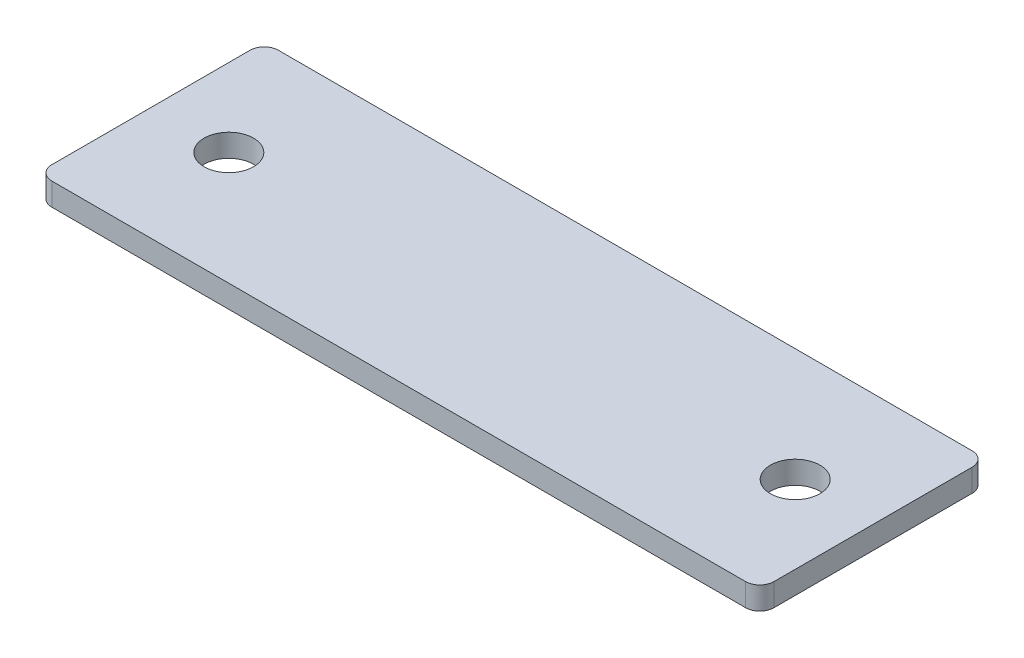
ISO-10303-21;
HEADER;
FILE_DESCRIPTION(('STEP AP214'),'2;1');
FILE_NAME('part.step','',(''),(''),'','','');
FILE_SCHEMA(('AUTOMOTIVE_DESIGN { 1 0 10303 214 1 1 1 1 }'));
ENDSEC;
DATA;
#1=APPLICATION_CONTEXT('core data for automotive mechanical design processes');
#2=APPLICATION_PROTOCOL_DEFINITION('international standard','automotive_design',2000,#1);
#3=PRODUCT_CONTEXT('',#1,'mechanical');
#4=PRODUCT('Part','Part','',(#3));
#5=PRODUCT_RELATED_PRODUCT_CATEGORY('part','',(#4));
#6=PRODUCT_DEFINITION_FORMATION('','',#4);
#7=PRODUCT_DEFINITION_CONTEXT('part definition',#1,'design');
#8=PRODUCT_DEFINITION('design','',#6,#7);
#9=PRODUCT_DEFINITION_SHAPE('','',#8);
#10=(LENGTH_UNIT() NAMED_UNIT(*) SI_UNIT(.MILLI.,.METRE.));
#11=(NAMED_UNIT(*) PLANE_ANGLE_UNIT() SI_UNIT($,.RADIAN.));
#12=(NAMED_UNIT(*) SI_UNIT($,.STERADIAN.) SOLID_ANGLE_UNIT());
#13=UNCERTAINTY_MEASURE_WITH_UNIT(LENGTH_MEASURE(1.E-05),#10,'distance_accuracy_value','');
#14=(GEOMETRIC_REPRESENTATION_CONTEXT(3) GLOBAL_UNCERTAINTY_ASSIGNED_CONTEXT((#13)) GLOBAL_UNIT_ASSIGNED_CONTEXT((#10,
#11,#12)) REPRESENTATION_CONTEXT('',''));
#15=CARTESIAN_POINT('',(0.,0.,0.));
#16=DIRECTION('',(0.,0.,1.));
#17=DIRECTION('',(1.,0.,0.));
#18=AXIS2_PLACEMENT_3D('',#15,#16,#17);
#19=CARTESIAN_POINT('',(0.,1.6,0.));
#20=DIRECTION('',(0.,1.,0.));
#21=DIRECTION('',(0.,0.,1.));
#22=AXIS2_PLACEMENT_3D('',#19,#20,#21);
#23=PLANE('',#22);
#24=CARTESIAN_POINT('',(-20.,1.6,0.));
#25=DIRECTION('',(0.,1.,0.));
#26=DIRECTION('',(0.,0.,1.));
#27=AXIS2_PLACEMENT_3D('',#24,#25,#26);
#28=CIRCLE('',#27,1.75);
#29=CARTESIAN_POINT('',(-20.,1.6,1.75));
#30=VERTEX_POINT('',#29);
#31=EDGE_CURVE('E163',#30,#30,#28,.T.);
#32=ORIENTED_EDGE('',*,*,#31,.F.);
#33=EDGE_LOOP('',(#32));
#34=FACE_BOUND('',#33,.T.);
#35=DIRECTION('',(-1.,0.,0.));
#36=VECTOR('',#35,1.);
#37=CARTESIAN_POINT('',(-25.5,1.6,-8.));
#38=LINE('',#37,#36);
#39=CARTESIAN_POINT('',(24.5,1.6,-8.));
#40=VERTEX_POINT('',#39);
#41=CARTESIAN_POINT('',(-24.5,1.6,-8.));
#42=VERTEX_POINT('',#41);
#43=EDGE_CURVE('E170',#40,#42,#38,.T.);
#44=ORIENTED_EDGE('',*,*,#43,.T.);
#45=CARTESIAN_POINT('',(-24.5,1.6,-7.));
#46=DIRECTION('',(0.,1.,0.));
#47=DIRECTION('',(0.,0.,1.));
#48=AXIS2_PLACEMENT_3D('',#45,#46,#47);
#49=CIRCLE('',#48,1.);
#50=CARTESIAN_POINT('',(-25.5,1.6,-7.));
#51=VERTEX_POINT('',#50);
#52=EDGE_CURVE('E147',#42,#51,#49,.T.);
#53=ORIENTED_EDGE('',*,*,#52,.T.);
#54=DIRECTION('',(0.,0.,1.));
#55=VECTOR('',#54,1.);
#56=CARTESIAN_POINT('',(-25.5,1.6,-8.));
#57=LINE('',#56,#55);
#58=CARTESIAN_POINT('',(-25.5,1.6,7.));
#59=VERTEX_POINT('',#58);
#60=EDGE_CURVE('E117',#51,#59,#57,.T.);
#61=ORIENTED_EDGE('',*,*,#60,.T.);
#62=CARTESIAN_POINT('',(-24.5,1.6,7.));
#63=DIRECTION('',(0.,1.,0.));
#64=DIRECTION('',(0.,0.,1.));
#65=AXIS2_PLACEMENT_3D('',#62,#63,#64);
#66=CIRCLE('',#65,1.);
#67=CARTESIAN_POINT('',(-24.5,1.6,8.));
#68=VERTEX_POINT('',#67);
#69=EDGE_CURVE('E54',#59,#68,#66,.T.);
#70=ORIENTED_EDGE('',*,*,#69,.T.);
#71=DIRECTION('',(1.,0.,0.));
#72=VECTOR('',#71,1.);
#73=CARTESIAN_POINT('',(-25.5,1.6,8.));
#74=LINE('',#73,#72);
#75=CARTESIAN_POINT('',(24.5,1.6,8.));
#76=VERTEX_POINT('',#75);
#77=EDGE_CURVE('E133',#68,#76,#74,.T.);
#78=ORIENTED_EDGE('',*,*,#77,.T.);
#79=CARTESIAN_POINT('',(24.5,1.6,7.));
#80=DIRECTION('',(0.,1.,0.));
#81=DIRECTION('',(0.,0.,1.));
#82=AXIS2_PLACEMENT_3D('',#79,#80,#81);
#83=CIRCLE('',#82,1.);
#84=CARTESIAN_POINT('',(25.5,1.6,7.));
#85=VERTEX_POINT('',#84);
#86=EDGE_CURVE('E142',#76,#85,#83,.T.);
#87=ORIENTED_EDGE('',*,*,#86,.T.);
#88=DIRECTION('',(0.,0.,-1.));
#89=VECTOR('',#88,1.);
#90=CARTESIAN_POINT('',(25.5,1.6,-8.));
#91=LINE('',#90,#89);
#92=CARTESIAN_POINT('',(25.5,1.6,-7.));
#93=VERTEX_POINT('',#92);
#94=EDGE_CURVE('E127',#85,#93,#91,.T.);
#95=ORIENTED_EDGE('',*,*,#94,.T.);
#96=CARTESIAN_POINT('',(24.5,1.6,-7.));
#97=DIRECTION('',(0.,1.,0.));
#98=DIRECTION('',(0.,0.,1.));
#99=AXIS2_PLACEMENT_3D('',#96,#97,#98);
#100=CIRCLE('',#99,1.);
#101=EDGE_CURVE('E144',#93,#40,#100,.T.);
#102=ORIENTED_EDGE('',*,*,#101,.T.);
#103=EDGE_LOOP('',(#44,#53,#61,#70,#78,#87,#95,#102));
#104=FACE_BOUND('',#103,.T.);
#105=CARTESIAN_POINT('',(20.,1.6,0.));
#106=DIRECTION('',(0.,1.,0.));
#107=DIRECTION('',(0.,0.,1.));
#108=AXIS2_PLACEMENT_3D('',#105,#106,#107);
#109=CIRCLE('',#108,1.75);
#110=CARTESIAN_POINT('',(20.,1.6,1.74999999999999));
#111=VERTEX_POINT('',#110);
#112=EDGE_CURVE('E175',#111,#111,#109,.T.);
#113=ORIENTED_EDGE('',*,*,#112,.F.);
#114=EDGE_LOOP('',(#113));
#115=FACE_BOUND('',#114,.T.);
#116=ADVANCED_FACE('F32',(#34,#104,#115),#23,.T.);
#117=CARTESIAN_POINT('',(0.,0.,0.));
#118=DIRECTION('',(0.,1.,0.));
#119=DIRECTION('',(0.,0.,1.));
#120=AXIS2_PLACEMENT_3D('',#117,#118,#119);
#121=PLANE('',#120);
#122=CARTESIAN_POINT('',(-20.,0.,0.));
#123=DIRECTION('',(0.,1.,0.));
#124=DIRECTION('',(0.,0.,1.));
#125=AXIS2_PLACEMENT_3D('',#122,#123,#124);
#126=CIRCLE('',#125,1.75);
#127=CARTESIAN_POINT('',(-20.,0.,1.75));
#128=VERTEX_POINT('',#127);
#129=EDGE_CURVE('E165',#128,#128,#126,.T.);
#130=ORIENTED_EDGE('',*,*,#129,.T.);
#131=EDGE_LOOP('',(#130));
#132=FACE_BOUND('',#131,.T.);
#133=DIRECTION('',(0.,0.,1.));
#134=VECTOR('',#133,1.);
#135=CARTESIAN_POINT('',(-25.5,0.,-8.));
#136=LINE('',#135,#134);
#137=CARTESIAN_POINT('',(-25.5,0.,-7.));
#138=VERTEX_POINT('',#137);
#139=CARTESIAN_POINT('',(-25.5,0.,7.));
#140=VERTEX_POINT('',#139);
#141=EDGE_CURVE('E115',#138,#140,#136,.T.);
#142=ORIENTED_EDGE('',*,*,#141,.F.);
#143=CARTESIAN_POINT('',(-24.5,0.,-7.));
#144=DIRECTION('',(0.,1.,0.));
#145=DIRECTION('',(0.,0.,1.));
#146=AXIS2_PLACEMENT_3D('',#143,#144,#145);
#147=CIRCLE('',#146,1.);
#148=CARTESIAN_POINT('',(-24.5,0.,-8.));
#149=VERTEX_POINT('',#148);
#150=EDGE_CURVE('E98',#138,#149,#147,.F.);
#151=ORIENTED_EDGE('',*,*,#150,.T.);
#152=DIRECTION('',(-1.,0.,0.));
#153=VECTOR('',#152,1.);
#154=CARTESIAN_POINT('',(-25.5,0.,-8.));
#155=LINE('',#154,#153);
#156=CARTESIAN_POINT('',(24.5,0.,-8.));
#157=VERTEX_POINT('',#156);
#158=EDGE_CURVE('E125',#157,#149,#155,.T.);
#159=ORIENTED_EDGE('',*,*,#158,.F.);
#160=CARTESIAN_POINT('',(24.5,0.,-7.));
#161=DIRECTION('',(0.,1.,0.));
#162=DIRECTION('',(0.,0.,1.));
#163=AXIS2_PLACEMENT_3D('',#160,#161,#162);
#164=CIRCLE('',#163,1.);
#165=CARTESIAN_POINT('',(25.5,0.,-7.));
#166=VERTEX_POINT('',#165);
#167=EDGE_CURVE('E136',#157,#166,#164,.F.);
#168=ORIENTED_EDGE('',*,*,#167,.T.);
#169=DIRECTION('',(0.,0.,-1.));
#170=VECTOR('',#169,1.);
#171=CARTESIAN_POINT('',(25.5,0.,-8.));
#172=LINE('',#171,#170);
#173=CARTESIAN_POINT('',(25.5,0.,7.));
#174=VERTEX_POINT('',#173);
#175=EDGE_CURVE('E129',#174,#166,#172,.T.);
#176=ORIENTED_EDGE('',*,*,#175,.F.);
#177=CARTESIAN_POINT('',(24.5,0.,7.));
#178=DIRECTION('',(0.,1.,0.));
#179=DIRECTION('',(0.,0.,1.));
#180=AXIS2_PLACEMENT_3D('',#177,#178,#179);
#181=CIRCLE('',#180,1.);
#182=CARTESIAN_POINT('',(24.5,0.,8.));
#183=VERTEX_POINT('',#182);
#184=EDGE_CURVE('E118',#174,#183,#181,.F.);
#185=ORIENTED_EDGE('',*,*,#184,.T.);
#186=DIRECTION('',(1.,0.,0.));
#187=VECTOR('',#186,1.);
#188=CARTESIAN_POINT('',(-25.5,0.,8.));
#189=LINE('',#188,#187);
#190=CARTESIAN_POINT('',(-24.5,0.,8.));
#191=VERTEX_POINT('',#190);
#192=EDGE_CURVE('E124',#191,#183,#189,.T.);
#193=ORIENTED_EDGE('',*,*,#192,.F.);
#194=CARTESIAN_POINT('',(-24.5,0.,7.));
#195=DIRECTION('',(0.,1.,0.));
#196=DIRECTION('',(0.,0.,1.));
#197=AXIS2_PLACEMENT_3D('',#194,#195,#196);
#198=CIRCLE('',#197,1.);
#199=EDGE_CURVE('E109',#191,#140,#198,.F.);
#200=ORIENTED_EDGE('',*,*,#199,.T.);
#201=EDGE_LOOP('',(#142,#151,#159,#168,#176,#185,#193,#200));
#202=FACE_BOUND('',#201,.T.);
#203=CARTESIAN_POINT('',(20.,0.,0.));
#204=DIRECTION('',(0.,1.,0.));
#205=DIRECTION('',(0.,0.,1.));
#206=AXIS2_PLACEMENT_3D('',#203,#204,#205);
#207=CIRCLE('',#206,1.75);
#208=CARTESIAN_POINT('',(20.,0.,1.74999999999999));
#209=VERTEX_POINT('',#208);
#210=EDGE_CURVE('E177',#209,#209,#207,.T.);
#211=ORIENTED_EDGE('',*,*,#210,.T.);
#212=EDGE_LOOP('',(#211));
#213=FACE_BOUND('',#212,.T.);
#214=ADVANCED_FACE('F121',(#132,#202,#213),#121,.F.);
#215=CARTESIAN_POINT('',(25.5,1.6,-8.));
#216=DIRECTION('',(-1.,0.,0.));
#217=DIRECTION('',(0.,0.,1.));
#218=AXIS2_PLACEMENT_3D('',#215,#216,#217);
#219=PLANE('',#218);
#220=ORIENTED_EDGE('',*,*,#175,.T.);
#221=DIRECTION('',(0.,-1.,0.));
#222=VECTOR('',#221,1.);
#223=CARTESIAN_POINT('',(25.5,1.6,-7.));
#224=LINE('',#223,#222);
#225=EDGE_CURVE('E11',#166,#93,#224,.F.);
#226=ORIENTED_EDGE('',*,*,#225,.T.);
#227=ORIENTED_EDGE('',*,*,#94,.F.);
#228=DIRECTION('',(0.,-1.,0.));
#229=VECTOR('',#228,1.);
#230=CARTESIAN_POINT('',(25.5,1.6,7.));
#231=LINE('',#230,#229);
#232=EDGE_CURVE('E40',#85,#174,#231,.T.);
#233=ORIENTED_EDGE('',*,*,#232,.T.);
#234=EDGE_LOOP('',(#220,#226,#227,#233));
#235=FACE_BOUND('',#234,.T.);
#236=ADVANCED_FACE('F158',(#235),#219,.F.);
#237=CARTESIAN_POINT('',(-25.5,1.6,-8.));
#238=DIRECTION('',(0.,0.,1.));
#239=DIRECTION('',(1.,0.,0.));
#240=AXIS2_PLACEMENT_3D('',#237,#238,#239);
#241=PLANE('',#240);
#242=ORIENTED_EDGE('',*,*,#158,.T.);
#243=DIRECTION('',(0.,-1.,0.));
#244=VECTOR('',#243,1.);
#245=CARTESIAN_POINT('',(-24.5,1.6,-8.));
#246=LINE('',#245,#244);
#247=EDGE_CURVE('E103',#149,#42,#246,.F.);
#248=ORIENTED_EDGE('',*,*,#247,.T.);
#249=ORIENTED_EDGE('',*,*,#43,.F.);
#250=DIRECTION('',(0.,-1.,0.));
#251=VECTOR('',#250,1.);
#252=CARTESIAN_POINT('',(24.5,1.6,-8.));
#253=LINE('',#252,#251);
#254=EDGE_CURVE('E108',#40,#157,#253,.T.);
#255=ORIENTED_EDGE('',*,*,#254,.T.);
#256=EDGE_LOOP('',(#242,#248,#249,#255));
#257=FACE_BOUND('',#256,.T.);
#258=ADVANCED_FACE('F204',(#257),#241,.F.);
#259=CARTESIAN_POINT('',(-25.5,1.6,-8.));
#260=DIRECTION('',(1.,0.,0.));
#261=DIRECTION('',(0.,0.,-1.));
#262=AXIS2_PLACEMENT_3D('',#259,#260,#261);
#263=PLANE('',#262);
#264=ORIENTED_EDGE('',*,*,#60,.F.);
#265=DIRECTION('',(0.,-1.,0.));
#266=VECTOR('',#265,1.);
#267=CARTESIAN_POINT('',(-25.5,1.6,-7.));
#268=LINE('',#267,#266);
#269=EDGE_CURVE('E102',#51,#138,#268,.T.);
#270=ORIENTED_EDGE('',*,*,#269,.T.);
#271=ORIENTED_EDGE('',*,*,#141,.T.);
#272=DIRECTION('',(0.,-1.,0.));
#273=VECTOR('',#272,1.);
#274=CARTESIAN_POINT('',(-25.5,1.6,7.));
#275=LINE('',#274,#273);
#276=EDGE_CURVE('E119',#140,#59,#275,.F.);
#277=ORIENTED_EDGE('',*,*,#276,.T.);
#278=EDGE_LOOP('',(#264,#270,#271,#277));
#279=FACE_BOUND('',#278,.T.);
#280=ADVANCED_FACE('F114',(#279),#263,.F.);
#281=CARTESIAN_POINT('',(-25.5,1.6,8.));
#282=DIRECTION('',(0.,0.,-1.));
#283=DIRECTION('',(-1.,0.,0.));
#284=AXIS2_PLACEMENT_3D('',#281,#282,#283);
#285=PLANE('',#284);
#286=ORIENTED_EDGE('',*,*,#77,.F.);
#287=DIRECTION('',(0.,-1.,0.));
#288=VECTOR('',#287,1.);
#289=CARTESIAN_POINT('',(-24.5,1.6,8.));
#290=LINE('',#289,#288);
#291=EDGE_CURVE('E150',#68,#191,#290,.T.);
#292=ORIENTED_EDGE('',*,*,#291,.T.);
#293=ORIENTED_EDGE('',*,*,#192,.T.);
#294=DIRECTION('',(0.,-1.,0.));
#295=VECTOR('',#294,1.);
#296=CARTESIAN_POINT('',(24.5,1.6,8.));
#297=LINE('',#296,#295);
#298=EDGE_CURVE('E47',#183,#76,#297,.F.);
#299=ORIENTED_EDGE('',*,*,#298,.T.);
#300=EDGE_LOOP('',(#286,#292,#293,#299));
#301=FACE_BOUND('',#300,.T.);
#302=ADVANCED_FACE('F199',(#301),#285,.F.);
#303=CARTESIAN_POINT('',(-20.,1.6,0.));
#304=DIRECTION('',(0.,-1.,0.));
#305=DIRECTION('',(0.,0.,-1.));
#306=AXIS2_PLACEMENT_3D('',#303,#304,#305);
#307=CYLINDRICAL_SURFACE('',#306,1.75);
#308=ORIENTED_EDGE('',*,*,#31,.T.);
#309=EDGE_LOOP('',(#308));
#310=FACE_BOUND('',#309,.T.);
#311=ORIENTED_EDGE('',*,*,#129,.F.);
#312=EDGE_LOOP('',(#311));
#313=FACE_BOUND('',#312,.T.);
#314=ADVANCED_FACE('F196',(#310,#313),#307,.F.);
#315=CARTESIAN_POINT('',(20.,1.6,0.));
#316=DIRECTION('',(0.,-1.,0.));
#317=DIRECTION('',(0.,0.,-1.));
#318=AXIS2_PLACEMENT_3D('',#315,#316,#317);
#319=CYLINDRICAL_SURFACE('',#318,1.75);
#320=ORIENTED_EDGE('',*,*,#112,.T.);
#321=EDGE_LOOP('',(#320));
#322=FACE_BOUND('',#321,.T.);
#323=ORIENTED_EDGE('',*,*,#210,.F.);
#324=EDGE_LOOP('',(#323));
#325=FACE_BOUND('',#324,.T.);
#326=ADVANCED_FACE('F183',(#322,#325),#319,.F.);
#327=CARTESIAN_POINT('',(-24.5,1.6,-7.));
#328=DIRECTION('',(0.,-1.,0.));
#329=DIRECTION('',(0.,0.,-1.));
#330=AXIS2_PLACEMENT_3D('',#327,#328,#329);
#331=CYLINDRICAL_SURFACE('',#330,1.);
#332=ORIENTED_EDGE('',*,*,#52,.F.);
#333=ORIENTED_EDGE('',*,*,#247,.F.);
#334=ORIENTED_EDGE('',*,*,#150,.F.);
#335=ORIENTED_EDGE('',*,*,#269,.F.);
#336=EDGE_LOOP('',(#332,#333,#334,#335));
#337=FACE_BOUND('',#336,.T.);
#338=ADVANCED_FACE('F101',(#337),#331,.T.);
#339=CARTESIAN_POINT('',(-24.5,1.6,7.));
#340=DIRECTION('',(0.,-1.,0.));
#341=DIRECTION('',(0.,0.,-1.));
#342=AXIS2_PLACEMENT_3D('',#339,#340,#341);
#343=CYLINDRICAL_SURFACE('',#342,1.);
#344=ORIENTED_EDGE('',*,*,#69,.F.);
#345=ORIENTED_EDGE('',*,*,#276,.F.);
#346=ORIENTED_EDGE('',*,*,#199,.F.);
#347=ORIENTED_EDGE('',*,*,#291,.F.);
#348=EDGE_LOOP('',(#344,#345,#346,#347));
#349=FACE_BOUND('',#348,.T.);
#350=ADVANCED_FACE('F212',(#349),#343,.T.);
#351=CARTESIAN_POINT('',(24.5,1.6,-7.));
#352=DIRECTION('',(0.,-1.,0.));
#353=DIRECTION('',(0.,0.,-1.));
#354=AXIS2_PLACEMENT_3D('',#351,#352,#353);
#355=CYLINDRICAL_SURFACE('',#354,1.);
#356=ORIENTED_EDGE('',*,*,#101,.F.);
#357=ORIENTED_EDGE('',*,*,#225,.F.);
#358=ORIENTED_EDGE('',*,*,#167,.F.);
#359=ORIENTED_EDGE('',*,*,#254,.F.);
#360=EDGE_LOOP('',(#356,#357,#358,#359));
#361=FACE_BOUND('',#360,.T.);
#362=ADVANCED_FACE('F214',(#361),#355,.T.);
#363=CARTESIAN_POINT('',(24.5,1.6,7.));
#364=DIRECTION('',(0.,-1.,0.));
#365=DIRECTION('',(0.,0.,-1.));
#366=AXIS2_PLACEMENT_3D('',#363,#364,#365);
#367=CYLINDRICAL_SURFACE('',#366,1.);
#368=ORIENTED_EDGE('',*,*,#86,.F.);
#369=ORIENTED_EDGE('',*,*,#298,.F.);
#370=ORIENTED_EDGE('',*,*,#184,.F.);
#371=ORIENTED_EDGE('',*,*,#232,.F.);
#372=EDGE_LOOP('',(#368,#369,#370,#371));
#373=FACE_BOUND('',#372,.T.);
#374=ADVANCED_FACE('F34',(#373),#367,.T.);
#375=CLOSED_SHELL('',(#116,#214,#236,#258,#280,#302,#314,#326,#338,#350,#362,#374));
#376=MANIFOLD_SOLID_BREP('B2',#375);
#377=ADVANCED_BREP_SHAPE_REPRESENTATION('',(#18,#376),#14);
#378=SHAPE_DEFINITION_REPRESENTATION(#9,#377);
ENDSEC;
END-ISO-10303-21;
